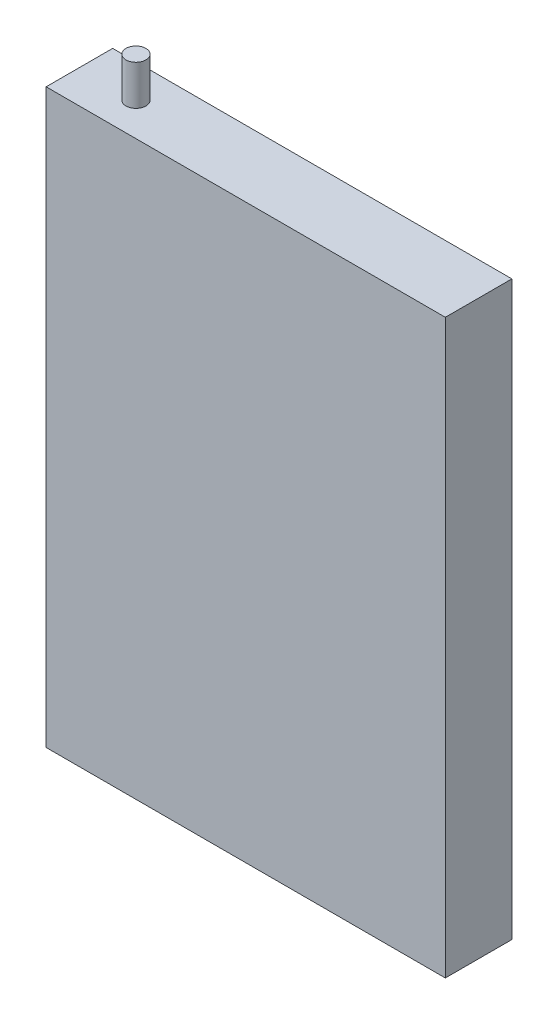
ISO-10303-21;
HEADER;
FILE_DESCRIPTION(('STEP AP214'),'2;1');
FILE_NAME('part.step','',(''),(''),'','','');
FILE_SCHEMA(('AUTOMOTIVE_DESIGN { 1 0 10303 214 1 1 1 1 }'));
ENDSEC;
DATA;
#1=APPLICATION_CONTEXT('core data for automotive mechanical design processes');
#2=APPLICATION_PROTOCOL_DEFINITION('international standard','automotive_design',2000,#1);
#3=PRODUCT_CONTEXT('',#1,'mechanical');
#4=PRODUCT('Part','Part','',(#3));
#5=PRODUCT_RELATED_PRODUCT_CATEGORY('part','',(#4));
#6=PRODUCT_DEFINITION_FORMATION('','',#4);
#7=PRODUCT_DEFINITION_CONTEXT('part definition',#1,'design');
#8=PRODUCT_DEFINITION('design','',#6,#7);
#9=PRODUCT_DEFINITION_SHAPE('','',#8);
#10=(LENGTH_UNIT() NAMED_UNIT(*) SI_UNIT(.MILLI.,.METRE.));
#11=(NAMED_UNIT(*) PLANE_ANGLE_UNIT() SI_UNIT($,.RADIAN.));
#12=(NAMED_UNIT(*) SI_UNIT($,.STERADIAN.) SOLID_ANGLE_UNIT());
#13=UNCERTAINTY_MEASURE_WITH_UNIT(LENGTH_MEASURE(1.E-05),#10,'distance_accuracy_value','');
#14=(GEOMETRIC_REPRESENTATION_CONTEXT(3) GLOBAL_UNCERTAINTY_ASSIGNED_CONTEXT((#13)) GLOBAL_UNIT_ASSIGNED_CONTEXT((#10,
#11,#12)) REPRESENTATION_CONTEXT('',''));
#15=CARTESIAN_POINT('',(0.,0.,0.));
#16=DIRECTION('',(0.,0.,1.));
#17=DIRECTION('',(1.,0.,0.));
#18=AXIS2_PLACEMENT_3D('',#15,#16,#17);
#19=CARTESIAN_POINT('',(0.,0.,10.));
#20=DIRECTION('',(1.,0.,0.));
#21=DIRECTION('',(0.,0.,-1.));
#22=AXIS2_PLACEMENT_3D('',#19,#20,#21);
#23=PLANE('',#22);
#24=DIRECTION('',(0.,-1.,0.));
#25=VECTOR('',#24,1.);
#26=CARTESIAN_POINT('',(0.,0.,0.));
#27=LINE('',#26,#25);
#28=CARTESIAN_POINT('',(0.,0.,0.));
#29=VERTEX_POINT('',#28);
#30=CARTESIAN_POINT('',(0.,-86.,0.));
#31=VERTEX_POINT('',#30);
#32=EDGE_CURVE('E116',#29,#31,#27,.T.);
#33=ORIENTED_EDGE('',*,*,#32,.T.);
#34=DIRECTION('',(0.,0.,-1.));
#35=VECTOR('',#34,1.);
#36=CARTESIAN_POINT('',(0.,-86.,10.));
#37=LINE('',#36,#35);
#38=CARTESIAN_POINT('',(0.,-86.,10.));
#39=VERTEX_POINT('',#38);
#40=EDGE_CURVE('E54',#39,#31,#37,.T.);
#41=ORIENTED_EDGE('',*,*,#40,.F.);
#42=DIRECTION('',(0.,-1.,0.));
#43=VECTOR('',#42,1.);
#44=CARTESIAN_POINT('',(0.,0.,10.));
#45=LINE('',#44,#43);
#46=CARTESIAN_POINT('',(0.,0.,10.));
#47=VERTEX_POINT('',#46);
#48=EDGE_CURVE('E98',#47,#39,#45,.T.);
#49=ORIENTED_EDGE('',*,*,#48,.F.);
#50=DIRECTION('',(0.,0.,-1.));
#51=VECTOR('',#50,1.);
#52=CARTESIAN_POINT('',(0.,0.,10.));
#53=LINE('',#52,#51);
#54=EDGE_CURVE('E112',#47,#29,#53,.T.);
#55=ORIENTED_EDGE('',*,*,#54,.T.);
#56=EDGE_LOOP('',(#33,#41,#49,#55));
#57=FACE_BOUND('',#56,.T.);
#58=ADVANCED_FACE('F45',(#57),#23,.F.);
#59=CARTESIAN_POINT('',(0.,-86.,10.));
#60=DIRECTION('',(0.,1.,0.));
#61=DIRECTION('',(0.,0.,1.));
#62=AXIS2_PLACEMENT_3D('',#59,#60,#61);
#63=PLANE('',#62);
#64=DIRECTION('',(1.,0.,0.));
#65=VECTOR('',#64,1.);
#66=CARTESIAN_POINT('',(0.,-86.,0.));
#67=LINE('',#66,#65);
#68=CARTESIAN_POINT('',(60.,-86.,0.));
#69=VERTEX_POINT('',#68);
#70=EDGE_CURVE('E104',#31,#69,#67,.T.);
#71=ORIENTED_EDGE('',*,*,#70,.T.);
#72=DIRECTION('',(0.,0.,-1.));
#73=VECTOR('',#72,1.);
#74=CARTESIAN_POINT('',(60.,-86.,10.));
#75=LINE('',#74,#73);
#76=CARTESIAN_POINT('',(60.,-86.,10.));
#77=VERTEX_POINT('',#76);
#78=EDGE_CURVE('E102',#77,#69,#75,.T.);
#79=ORIENTED_EDGE('',*,*,#78,.F.);
#80=DIRECTION('',(1.,0.,0.));
#81=VECTOR('',#80,1.);
#82=CARTESIAN_POINT('',(0.,-86.,10.));
#83=LINE('',#82,#81);
#84=EDGE_CURVE('E93',#39,#77,#83,.T.);
#85=ORIENTED_EDGE('',*,*,#84,.F.);
#86=ORIENTED_EDGE('',*,*,#40,.T.);
#87=EDGE_LOOP('',(#71,#79,#85,#86));
#88=FACE_BOUND('',#87,.T.);
#89=ADVANCED_FACE('F103',(#88),#63,.F.);
#90=CARTESIAN_POINT('',(60.,0.,10.));
#91=DIRECTION('',(-1.,0.,0.));
#92=DIRECTION('',(0.,-1.,0.));
#93=AXIS2_PLACEMENT_3D('',#90,#91,#92);
#94=PLANE('',#93);
#95=DIRECTION('',(0.,1.,0.));
#96=VECTOR('',#95,1.);
#97=CARTESIAN_POINT('',(60.,0.,0.));
#98=LINE('',#97,#96);
#99=CARTESIAN_POINT('',(60.,0.,0.));
#100=VERTEX_POINT('',#99);
#101=EDGE_CURVE('E79',#69,#100,#98,.T.);
#102=ORIENTED_EDGE('',*,*,#101,.T.);
#103=DIRECTION('',(0.,0.,-1.));
#104=VECTOR('',#103,1.);
#105=CARTESIAN_POINT('',(60.,0.,10.));
#106=LINE('',#105,#104);
#107=CARTESIAN_POINT('',(60.,0.,10.));
#108=VERTEX_POINT('',#107);
#109=EDGE_CURVE('E106',#108,#100,#106,.T.);
#110=ORIENTED_EDGE('',*,*,#109,.F.);
#111=DIRECTION('',(0.,1.,0.));
#112=VECTOR('',#111,1.);
#113=CARTESIAN_POINT('',(60.,0.,10.));
#114=LINE('',#113,#112);
#115=EDGE_CURVE('E96',#77,#108,#114,.T.);
#116=ORIENTED_EDGE('',*,*,#115,.F.);
#117=ORIENTED_EDGE('',*,*,#78,.T.);
#118=EDGE_LOOP('',(#102,#110,#116,#117));
#119=FACE_BOUND('',#118,.T.);
#120=ADVANCED_FACE('F108',(#119),#94,.F.);
#121=CARTESIAN_POINT('',(0.,0.,10.));
#122=DIRECTION('',(0.,-1.,0.));
#123=DIRECTION('',(0.,0.,-1.));
#124=AXIS2_PLACEMENT_3D('',#121,#122,#123);
#125=PLANE('',#124);
#126=CARTESIAN_POINT('',(8.5,0.,5.));
#127=DIRECTION('',(0.,-1.,0.));
#128=DIRECTION('',(0.,0.,-1.));
#129=AXIS2_PLACEMENT_3D('',#126,#127,#128);
#130=CIRCLE('',#129,1.5);
#131=CARTESIAN_POINT('',(8.5,0.,3.5));
#132=VERTEX_POINT('',#131);
#133=EDGE_CURVE('E11',#132,#132,#130,.F.);
#134=ORIENTED_EDGE('',*,*,#133,.F.);
#135=EDGE_LOOP('',(#134));
#136=FACE_BOUND('',#135,.T.);
#137=DIRECTION('',(-1.,0.,0.));
#138=VECTOR('',#137,1.);
#139=CARTESIAN_POINT('',(0.,0.,0.));
#140=LINE('',#139,#138);
#141=EDGE_CURVE('E85',#100,#29,#140,.T.);
#142=ORIENTED_EDGE('',*,*,#141,.T.);
#143=ORIENTED_EDGE('',*,*,#54,.F.);
#144=DIRECTION('',(-1.,0.,0.));
#145=VECTOR('',#144,1.);
#146=CARTESIAN_POINT('',(0.,0.,10.));
#147=LINE('',#146,#145);
#148=EDGE_CURVE('E62',#108,#47,#147,.T.);
#149=ORIENTED_EDGE('',*,*,#148,.F.);
#150=ORIENTED_EDGE('',*,*,#109,.T.);
#151=EDGE_LOOP('',(#142,#143,#149,#150));
#152=FACE_BOUND('',#151,.T.);
#153=ADVANCED_FACE('F145',(#136,#152),#125,.F.);
#154=CARTESIAN_POINT('',(0.,0.,10.));
#155=DIRECTION('',(0.,0.,1.));
#156=DIRECTION('',(1.,0.,0.));
#157=AXIS2_PLACEMENT_3D('',#154,#155,#156);
#158=PLANE('',#157);
#159=ORIENTED_EDGE('',*,*,#48,.T.);
#160=ORIENTED_EDGE('',*,*,#84,.T.);
#161=ORIENTED_EDGE('',*,*,#115,.T.);
#162=ORIENTED_EDGE('',*,*,#148,.T.);
#163=EDGE_LOOP('',(#159,#160,#161,#162));
#164=FACE_BOUND('',#163,.T.);
#165=ADVANCED_FACE('F94',(#164),#158,.T.);
#166=CARTESIAN_POINT('',(0.,0.,0.));
#167=DIRECTION('',(0.,0.,1.));
#168=DIRECTION('',(1.,0.,0.));
#169=AXIS2_PLACEMENT_3D('',#166,#167,#168);
#170=PLANE('',#169);
#171=ORIENTED_EDGE('',*,*,#32,.F.);
#172=ORIENTED_EDGE('',*,*,#141,.F.);
#173=ORIENTED_EDGE('',*,*,#101,.F.);
#174=ORIENTED_EDGE('',*,*,#70,.F.);
#175=EDGE_LOOP('',(#171,#172,#173,#174));
#176=FACE_BOUND('',#175,.T.);
#177=ADVANCED_FACE('F134',(#176),#170,.F.);
#178=CARTESIAN_POINT('',(8.5,6.,5.));
#179=DIRECTION('',(0.,-1.,0.));
#180=DIRECTION('',(0.,0.,-1.));
#181=AXIS2_PLACEMENT_3D('',#178,#179,#180);
#182=CYLINDRICAL_SURFACE('',#181,1.5);
#183=CARTESIAN_POINT('',(8.5,6.,5.));
#184=DIRECTION('',(0.,1.,0.));
#185=DIRECTION('',(0.,0.,1.));
#186=AXIS2_PLACEMENT_3D('',#183,#184,#185);
#187=CIRCLE('',#186,1.5);
#188=CARTESIAN_POINT('',(8.5,6.,6.5));
#189=VERTEX_POINT('',#188);
#190=EDGE_CURVE('E120',#189,#189,#187,.T.);
#191=ORIENTED_EDGE('',*,*,#190,.F.);
#192=EDGE_LOOP('',(#191));
#193=FACE_BOUND('',#192,.T.);
#194=ORIENTED_EDGE('',*,*,#133,.T.);
#195=EDGE_LOOP('',(#194));
#196=FACE_BOUND('',#195,.T.);
#197=ADVANCED_FACE('F136',(#193,#196),#182,.T.);
#198=CARTESIAN_POINT('',(8.5,6.,5.));
#199=DIRECTION('',(0.,1.,0.));
#200=DIRECTION('',(0.,0.,1.));
#201=AXIS2_PLACEMENT_3D('',#198,#199,#200);
#202=PLANE('',#201);
#203=ORIENTED_EDGE('',*,*,#190,.T.);
#204=EDGE_LOOP('',(#203));
#205=FACE_BOUND('',#204,.T.);
#206=ADVANCED_FACE('F142',(#205),#202,.T.);
#207=CLOSED_SHELL('',(#58,#89,#120,#153,#165,#177,#197,#206));
#208=MANIFOLD_SOLID_BREP('B2',#207);
#209=ADVANCED_BREP_SHAPE_REPRESENTATION('',(#18,#208),#14);
#210=SHAPE_DEFINITION_REPRESENTATION(#9,#209);
ENDSEC;
END-ISO-10303-21;
